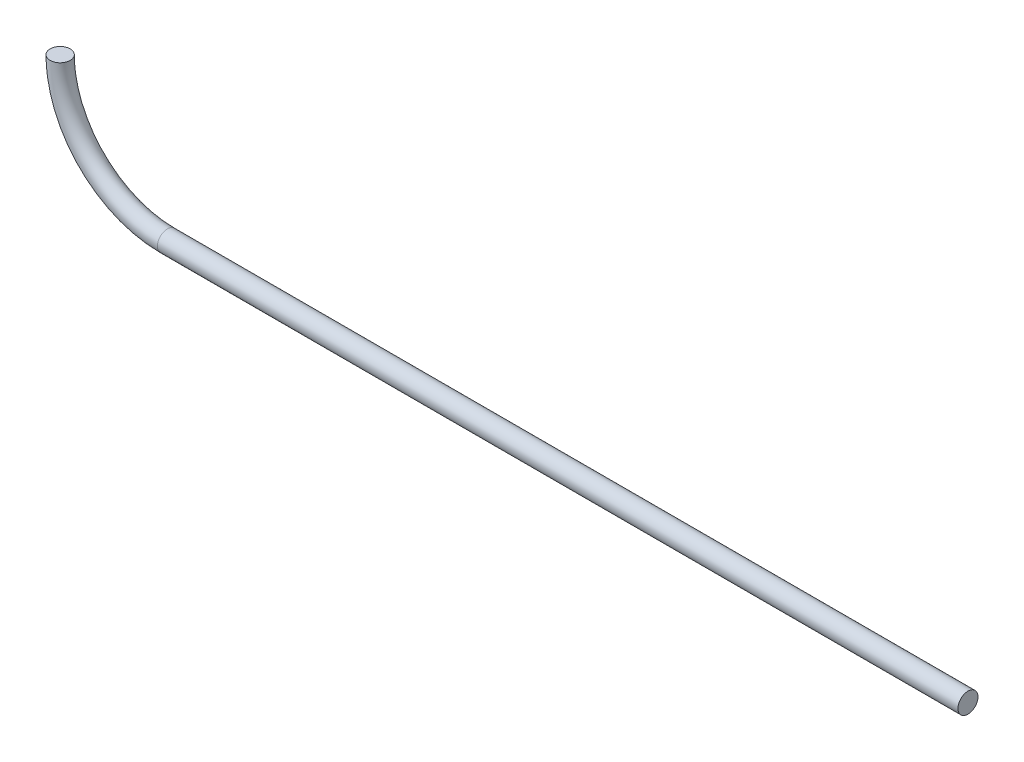
ISO-10303-21;
HEADER;
FILE_DESCRIPTION(('STEP AP214'),'2;1');
FILE_NAME('part.step','',(''),(''),'','','');
FILE_SCHEMA(('AUTOMOTIVE_DESIGN { 1 0 10303 214 1 1 1 1 }'));
ENDSEC;
DATA;
#1=APPLICATION_CONTEXT('core data for automotive mechanical design processes');
#2=APPLICATION_PROTOCOL_DEFINITION('international standard','automotive_design',2000,#1);
#3=PRODUCT_CONTEXT('',#1,'mechanical');
#4=PRODUCT('Part','Part','',(#3));
#5=PRODUCT_RELATED_PRODUCT_CATEGORY('part','',(#4));
#6=PRODUCT_DEFINITION_FORMATION('','',#4);
#7=PRODUCT_DEFINITION_CONTEXT('part definition',#1,'design');
#8=PRODUCT_DEFINITION('design','',#6,#7);
#9=PRODUCT_DEFINITION_SHAPE('','',#8);
#10=(LENGTH_UNIT() NAMED_UNIT(*) SI_UNIT(.MILLI.,.METRE.));
#11=(NAMED_UNIT(*) PLANE_ANGLE_UNIT() SI_UNIT($,.RADIAN.));
#12=(NAMED_UNIT(*) SI_UNIT($,.STERADIAN.) SOLID_ANGLE_UNIT());
#13=UNCERTAINTY_MEASURE_WITH_UNIT(LENGTH_MEASURE(1.E-05),#10,'distance_accuracy_value','');
#14=(GEOMETRIC_REPRESENTATION_CONTEXT(3) GLOBAL_UNCERTAINTY_ASSIGNED_CONTEXT((#13)) GLOBAL_UNIT_ASSIGNED_CONTEXT((#10,
#11,#12)) REPRESENTATION_CONTEXT('',''));
#15=CARTESIAN_POINT('',(0.,0.,0.));
#16=DIRECTION('',(0.,0.,1.));
#17=DIRECTION('',(1.,0.,0.));
#18=AXIS2_PLACEMENT_3D('',#15,#16,#17);
#19=CARTESIAN_POINT('',(-5.36,0.,0.));
#20=DIRECTION('',(0.,1.,0.));
#21=DIRECTION('',(0.,0.,-1.));
#22=AXIS2_PLACEMENT_3D('',#19,#20,#21);
#23=PLANE('',#22);
#24=CARTESIAN_POINT('',(-5.36,0.,0.));
#25=DIRECTION('',(0.,-1.,0.));
#26=DIRECTION('',(0.,0.,-1.));
#27=AXIS2_PLACEMENT_3D('',#24,#25,#26);
#28=CIRCLE('',#27,0.500000000000001);
#29=CARTESIAN_POINT('',(-5.36,0.,-0.500000000000001));
#30=VERTEX_POINT('',#29);
#31=EDGE_CURVE('E49',#30,#30,#28,.T.);
#32=ORIENTED_EDGE('',*,*,#31,.F.);
#33=EDGE_LOOP('',(#32));
#34=FACE_BOUND('',#33,.T.);
#35=ADVANCED_FACE('F37',(#34),#23,.T.);
#36=CARTESIAN_POINT('',(40.,-5.36,0.));
#37=DIRECTION('',(-1.,0.,0.));
#38=DIRECTION('',(0.,0.,-1.));
#39=AXIS2_PLACEMENT_3D('',#36,#37,#38);
#40=PLANE('',#39);
#41=CARTESIAN_POINT('',(40.,-5.36,0.));
#42=DIRECTION('',(1.,0.,0.));
#43=DIRECTION('',(0.,0.,-1.));
#44=AXIS2_PLACEMENT_3D('',#41,#42,#43);
#45=CIRCLE('',#44,0.500000000000001);
#46=CARTESIAN_POINT('',(40.,-5.36,-0.500000000000001));
#47=VERTEX_POINT('',#46);
#48=EDGE_CURVE('E11',#47,#47,#45,.T.);
#49=ORIENTED_EDGE('',*,*,#48,.T.);
#50=EDGE_LOOP('',(#49));
#51=FACE_BOUND('',#50,.T.);
#52=ADVANCED_FACE('F52',(#51),#40,.F.);
#53=CARTESIAN_POINT('',(0.,0.,0.));
#54=DIRECTION('',(0.,0.,-1.));
#55=DIRECTION('',(1.,0.,0.));
#56=AXIS2_PLACEMENT_3D('',#53,#54,#55);
#57=TOROIDAL_SURFACE('',#56,5.36,0.500000000000001);
#58=CARTESIAN_POINT('',(0.,-5.36,0.));
#59=DIRECTION('',(1.,0.,0.));
#60=DIRECTION('',(0.,0.,-1.));
#61=AXIS2_PLACEMENT_3D('',#58,#59,#60);
#62=CIRCLE('',#61,0.500000000000001);
#63=CARTESIAN_POINT('',(0.,-5.36,-0.500000000000001));
#64=VERTEX_POINT('',#63);
#65=EDGE_CURVE('E44',#64,#64,#62,.T.);
#66=ORIENTED_EDGE('',*,*,#65,.F.);
#67=EDGE_LOOP('',(#66));
#68=FACE_BOUND('',#67,.T.);
#69=ORIENTED_EDGE('',*,*,#31,.T.);
#70=EDGE_LOOP('',(#69));
#71=FACE_BOUND('',#70,.T.);
#72=ADVANCED_FACE('F57',(#68,#71),#57,.T.);
#73=CARTESIAN_POINT('',(0.,-5.36,0.));
#74=DIRECTION('',(1.,0.,0.));
#75=DIRECTION('',(0.,0.,1.));
#76=AXIS2_PLACEMENT_3D('',#73,#74,#75);
#77=CYLINDRICAL_SURFACE('',#76,0.500000000000001);
#78=ORIENTED_EDGE('',*,*,#48,.F.);
#79=EDGE_LOOP('',(#78));
#80=FACE_BOUND('',#79,.T.);
#81=ORIENTED_EDGE('',*,*,#65,.T.);
#82=EDGE_LOOP('',(#81));
#83=FACE_BOUND('',#82,.T.);
#84=ADVANCED_FACE('F54',(#80,#83),#77,.T.);
#85=CLOSED_SHELL('',(#35,#52,#72,#84));
#86=MANIFOLD_SOLID_BREP('B2',#85);
#87=ADVANCED_BREP_SHAPE_REPRESENTATION('',(#18,#86),#14);
#88=SHAPE_DEFINITION_REPRESENTATION(#9,#87);
ENDSEC;
END-ISO-10303-21;
